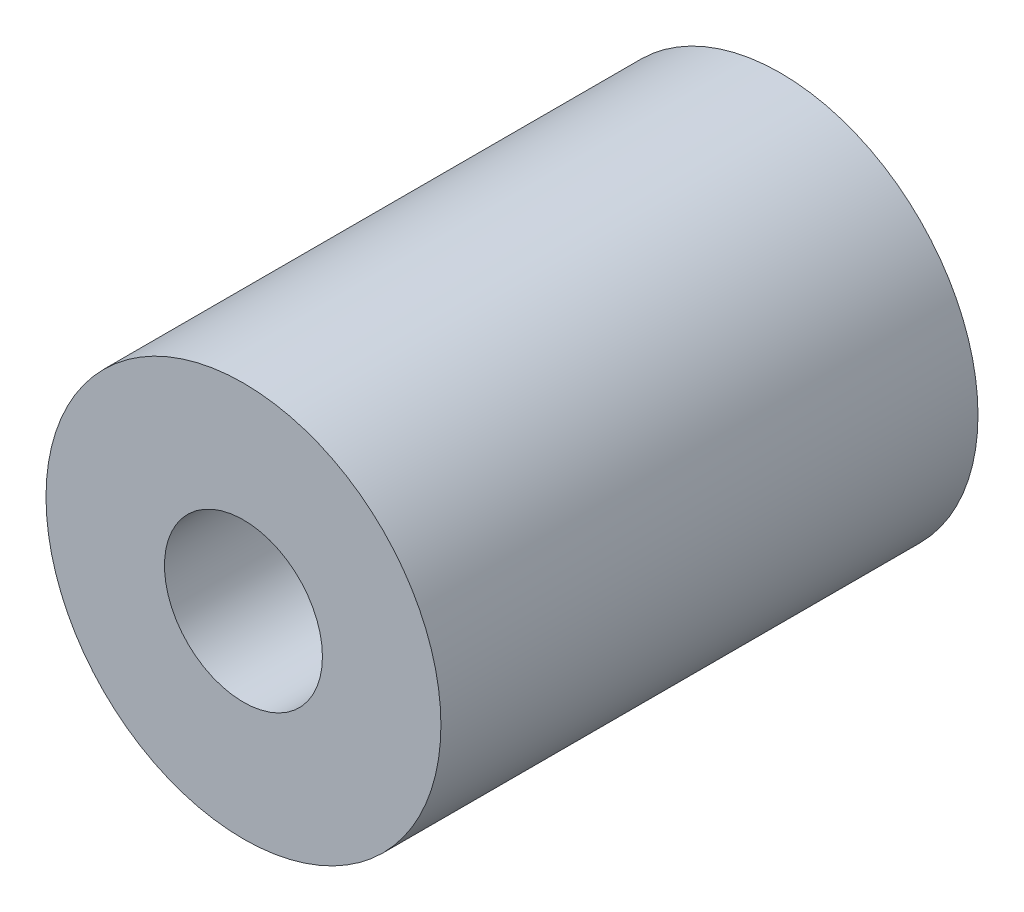
ISO-10303-21;
HEADER;
FILE_DESCRIPTION(('STEP AP214'),'2;1');
FILE_NAME('part.step','',(''),(''),'','','');
FILE_SCHEMA(('AUTOMOTIVE_DESIGN { 1 0 10303 214 1 1 1 1 }'));
ENDSEC;
DATA;
#1=APPLICATION_CONTEXT('core data for automotive mechanical design processes');
#2=APPLICATION_PROTOCOL_DEFINITION('international standard','automotive_design',2000,#1);
#3=PRODUCT_CONTEXT('',#1,'mechanical');
#4=PRODUCT('Part','Part','',(#3));
#5=PRODUCT_RELATED_PRODUCT_CATEGORY('part','',(#4));
#6=PRODUCT_DEFINITION_FORMATION('','',#4);
#7=PRODUCT_DEFINITION_CONTEXT('part definition',#1,'design');
#8=PRODUCT_DEFINITION('design','',#6,#7);
#9=PRODUCT_DEFINITION_SHAPE('','',#8);
#10=(LENGTH_UNIT() NAMED_UNIT(*) SI_UNIT(.MILLI.,.METRE.));
#11=(NAMED_UNIT(*) PLANE_ANGLE_UNIT() SI_UNIT($,.RADIAN.));
#12=(NAMED_UNIT(*) SI_UNIT($,.STERADIAN.) SOLID_ANGLE_UNIT());
#13=UNCERTAINTY_MEASURE_WITH_UNIT(LENGTH_MEASURE(1.E-05),#10,'distance_accuracy_value','');
#14=(GEOMETRIC_REPRESENTATION_CONTEXT(3) GLOBAL_UNCERTAINTY_ASSIGNED_CONTEXT((#13)) GLOBAL_UNIT_ASSIGNED_CONTEXT((#10,
#11,#12)) REPRESENTATION_CONTEXT('',''));
#15=CARTESIAN_POINT('',(0.,0.,0.));
#16=DIRECTION('',(0.,0.,1.));
#17=DIRECTION('',(1.,0.,0.));
#18=AXIS2_PLACEMENT_3D('',#15,#16,#17);
#19=CARTESIAN_POINT('',(0.,0.,40.8));
#20=DIRECTION('',(0.,0.,1.));
#21=DIRECTION('',(1.,0.,0.));
#22=AXIS2_PLACEMENT_3D('',#19,#20,#21);
#23=PLANE('',#22);
#24=CARTESIAN_POINT('',(0.,0.,40.8));
#25=DIRECTION('',(0.,0.,1.));
#26=DIRECTION('',(1.,0.,0.));
#27=AXIS2_PLACEMENT_3D('',#24,#25,#26);
#28=CIRCLE('',#27,15.);
#29=CARTESIAN_POINT('',(15.,0.,40.8));
#30=VERTEX_POINT('',#29);
#31=EDGE_CURVE('E10',#30,#30,#28,.T.);
#32=ORIENTED_EDGE('',*,*,#31,.T.);
#33=EDGE_LOOP('',(#32));
#34=FACE_BOUND('',#33,.T.);
#35=CARTESIAN_POINT('',(0.,0.,40.8));
#36=DIRECTION('',(0.,0.,1.));
#37=DIRECTION('',(1.,0.,0.));
#38=AXIS2_PLACEMENT_3D('',#35,#36,#37);
#39=CIRCLE('',#38,6.);
#40=CARTESIAN_POINT('',(6.,0.,40.8));
#41=VERTEX_POINT('',#40);
#42=EDGE_CURVE('E44',#41,#41,#39,.T.);
#43=ORIENTED_EDGE('',*,*,#42,.F.);
#44=EDGE_LOOP('',(#43));
#45=FACE_BOUND('',#44,.T.);
#46=ADVANCED_FACE('F33',(#34,#45),#23,.T.);
#47=CARTESIAN_POINT('',(0.,0.,0.));
#48=DIRECTION('',(0.,0.,1.));
#49=DIRECTION('',(1.,0.,0.));
#50=AXIS2_PLACEMENT_3D('',#47,#48,#49);
#51=PLANE('',#50);
#52=CARTESIAN_POINT('',(0.,0.,0.));
#53=DIRECTION('',(0.,0.,1.));
#54=DIRECTION('',(1.,0.,0.));
#55=AXIS2_PLACEMENT_3D('',#52,#53,#54);
#56=CIRCLE('',#55,15.);
#57=CARTESIAN_POINT('',(15.,0.,0.));
#58=VERTEX_POINT('',#57);
#59=EDGE_CURVE('E37',#58,#58,#56,.T.);
#60=ORIENTED_EDGE('',*,*,#59,.F.);
#61=EDGE_LOOP('',(#60));
#62=FACE_BOUND('',#61,.T.);
#63=CARTESIAN_POINT('',(0.,0.,0.));
#64=DIRECTION('',(0.,0.,1.));
#65=DIRECTION('',(1.,0.,0.));
#66=AXIS2_PLACEMENT_3D('',#63,#64,#65);
#67=CIRCLE('',#66,6.);
#68=CARTESIAN_POINT('',(6.,0.,0.));
#69=VERTEX_POINT('',#68);
#70=EDGE_CURVE('E46',#69,#69,#67,.T.);
#71=ORIENTED_EDGE('',*,*,#70,.T.);
#72=EDGE_LOOP('',(#71));
#73=FACE_BOUND('',#72,.T.);
#74=ADVANCED_FACE('F56',(#62,#73),#51,.F.);
#75=CARTESIAN_POINT('',(0.,0.,40.8));
#76=DIRECTION('',(0.,0.,-1.));
#77=DIRECTION('',(-1.,0.,0.));
#78=AXIS2_PLACEMENT_3D('',#75,#76,#77);
#79=CYLINDRICAL_SURFACE('',#78,15.);
#80=ORIENTED_EDGE('',*,*,#31,.F.);
#81=EDGE_LOOP('',(#80));
#82=FACE_BOUND('',#81,.T.);
#83=ORIENTED_EDGE('',*,*,#59,.T.);
#84=EDGE_LOOP('',(#83));
#85=FACE_BOUND('',#84,.T.);
#86=ADVANCED_FACE('F35',(#82,#85),#79,.T.);
#87=CARTESIAN_POINT('',(0.,0.,40.8));
#88=DIRECTION('',(0.,0.,-1.));
#89=DIRECTION('',(-1.,0.,0.));
#90=AXIS2_PLACEMENT_3D('',#87,#88,#89);
#91=CYLINDRICAL_SURFACE('',#90,6.);
#92=ORIENTED_EDGE('',*,*,#42,.T.);
#93=EDGE_LOOP('',(#92));
#94=FACE_BOUND('',#93,.T.);
#95=ORIENTED_EDGE('',*,*,#70,.F.);
#96=EDGE_LOOP('',(#95));
#97=FACE_BOUND('',#96,.T.);
#98=ADVANCED_FACE('F52',(#94,#97),#91,.F.);
#99=CLOSED_SHELL('',(#46,#74,#86,#98));
#100=MANIFOLD_SOLID_BREP('B2',#99);
#101=ADVANCED_BREP_SHAPE_REPRESENTATION('',(#18,#100),#14);
#102=SHAPE_DEFINITION_REPRESENTATION(#9,#101);
ENDSEC;
END-ISO-10303-21;
